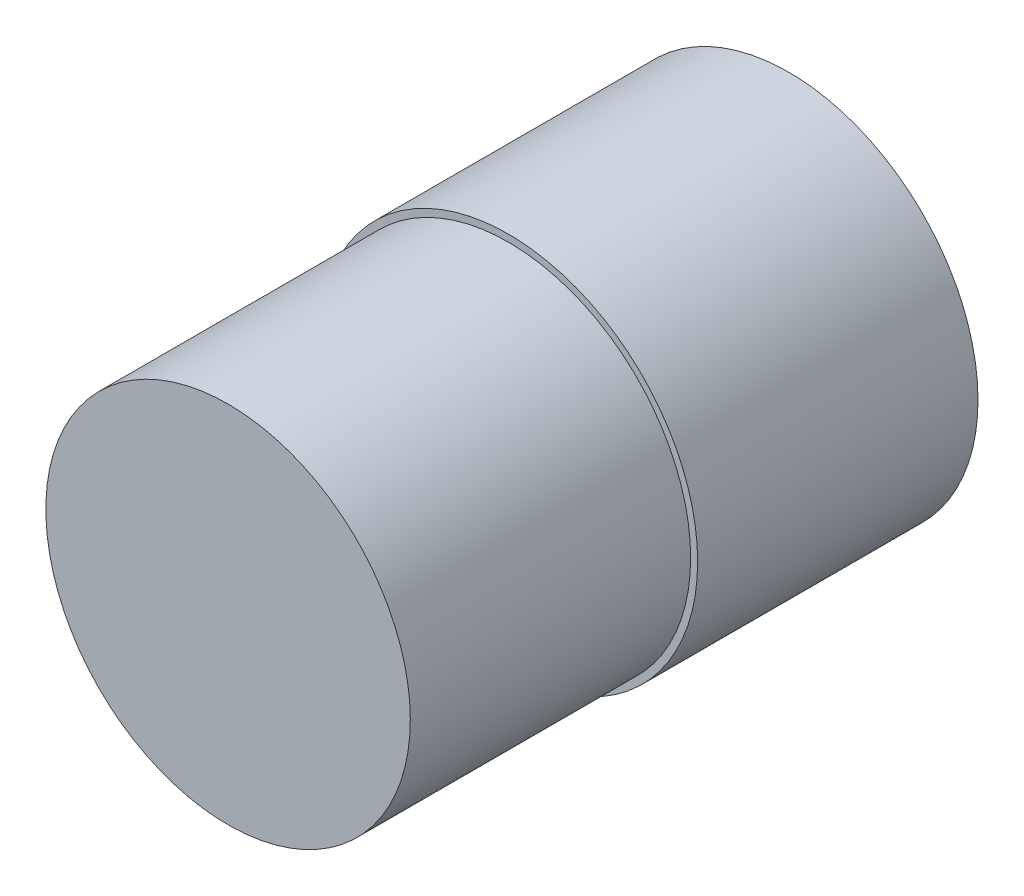
ISO-10303-21;
HEADER;
FILE_DESCRIPTION(('STEP AP214'),'2;1');
FILE_NAME('part.step','',(''),(''),'','','');
FILE_SCHEMA(('AUTOMOTIVE_DESIGN { 1 0 10303 214 1 1 1 1 }'));
ENDSEC;
DATA;
#1=APPLICATION_CONTEXT('core data for automotive mechanical design processes');
#2=APPLICATION_PROTOCOL_DEFINITION('international standard','automotive_design',2000,#1);
#3=PRODUCT_CONTEXT('',#1,'mechanical');
#4=PRODUCT('Part','Part','',(#3));
#5=PRODUCT_RELATED_PRODUCT_CATEGORY('part','',(#4));
#6=PRODUCT_DEFINITION_FORMATION('','',#4);
#7=PRODUCT_DEFINITION_CONTEXT('part definition',#1,'design');
#8=PRODUCT_DEFINITION('design','',#6,#7);
#9=PRODUCT_DEFINITION_SHAPE('','',#8);
#10=(LENGTH_UNIT() NAMED_UNIT(*) SI_UNIT(.MILLI.,.METRE.));
#11=(NAMED_UNIT(*) PLANE_ANGLE_UNIT() SI_UNIT($,.RADIAN.));
#12=(NAMED_UNIT(*) SI_UNIT($,.STERADIAN.) SOLID_ANGLE_UNIT());
#13=UNCERTAINTY_MEASURE_WITH_UNIT(LENGTH_MEASURE(1.E-05),#10,'distance_accuracy_value','');
#14=(GEOMETRIC_REPRESENTATION_CONTEXT(3) GLOBAL_UNCERTAINTY_ASSIGNED_CONTEXT((#13)) GLOBAL_UNIT_ASSIGNED_CONTEXT((#10,
#11,#12)) REPRESENTATION_CONTEXT('',''));
#15=CARTESIAN_POINT('',(0.,0.,0.));
#16=DIRECTION('',(0.,0.,1.));
#17=DIRECTION('',(1.,0.,0.));
#18=AXIS2_PLACEMENT_3D('',#15,#16,#17);
#19=CARTESIAN_POINT('',(0.,0.,10.));
#20=DIRECTION('',(0.,0.,1.));
#21=DIRECTION('',(1.,0.,0.));
#22=AXIS2_PLACEMENT_3D('',#19,#20,#21);
#23=PLANE('',#22);
#24=CARTESIAN_POINT('',(0.,0.,10.));
#25=DIRECTION('',(0.,0.,1.));
#26=DIRECTION('',(1.,0.,0.));
#27=AXIS2_PLACEMENT_3D('',#24,#25,#26);
#28=CIRCLE('',#27,6.75);
#29=CARTESIAN_POINT('',(6.75,0.,10.));
#30=VERTEX_POINT('',#29);
#31=EDGE_CURVE('E10',#30,#30,#28,.T.);
#32=ORIENTED_EDGE('',*,*,#31,.T.);
#33=EDGE_LOOP('',(#32));
#34=FACE_BOUND('',#33,.T.);
#35=CARTESIAN_POINT('',(0.,0.,10.));
#36=DIRECTION('',(0.,0.,1.));
#37=DIRECTION('',(1.,0.,0.));
#38=AXIS2_PLACEMENT_3D('',#35,#36,#37);
#39=CIRCLE('',#38,6.5);
#40=CARTESIAN_POINT('',(6.5,0.,10.));
#41=VERTEX_POINT('',#40);
#42=EDGE_CURVE('E55',#41,#41,#39,.T.);
#43=ORIENTED_EDGE('',*,*,#42,.F.);
#44=EDGE_LOOP('',(#43));
#45=FACE_BOUND('',#44,.T.);
#46=ADVANCED_FACE('F37',(#34,#45),#23,.T.);
#47=CARTESIAN_POINT('',(0.,0.,0.));
#48=DIRECTION('',(0.,0.,1.));
#49=DIRECTION('',(1.,0.,0.));
#50=AXIS2_PLACEMENT_3D('',#47,#48,#49);
#51=PLANE('',#50);
#52=CARTESIAN_POINT('',(0.,0.,0.));
#53=DIRECTION('',(0.,0.,1.));
#54=DIRECTION('',(1.,0.,0.));
#55=AXIS2_PLACEMENT_3D('',#52,#53,#54);
#56=CIRCLE('',#55,6.75);
#57=CARTESIAN_POINT('',(6.75,0.,0.));
#58=VERTEX_POINT('',#57);
#59=EDGE_CURVE('E41',#58,#58,#56,.T.);
#60=ORIENTED_EDGE('',*,*,#59,.F.);
#61=EDGE_LOOP('',(#60));
#62=FACE_BOUND('',#61,.T.);
#63=CARTESIAN_POINT('',(0.,0.,0.));
#64=DIRECTION('',(0.,0.,1.));
#65=DIRECTION('',(1.,0.,0.));
#66=AXIS2_PLACEMENT_3D('',#63,#64,#65);
#67=CIRCLE('',#66,2.725);
#68=CARTESIAN_POINT('',(2.725,0.,0.));
#69=VERTEX_POINT('',#68);
#70=EDGE_CURVE('E48',#69,#69,#67,.T.);
#71=ORIENTED_EDGE('',*,*,#70,.T.);
#72=EDGE_LOOP('',(#71));
#73=FACE_BOUND('',#72,.T.);
#74=ADVANCED_FACE('F66',(#62,#73),#51,.F.);
#75=CARTESIAN_POINT('',(0.,0.,10.));
#76=DIRECTION('',(0.,0.,-1.));
#77=DIRECTION('',(-1.,0.,0.));
#78=AXIS2_PLACEMENT_3D('',#75,#76,#77);
#79=CYLINDRICAL_SURFACE('',#78,6.75);
#80=ORIENTED_EDGE('',*,*,#31,.F.);
#81=EDGE_LOOP('',(#80));
#82=FACE_BOUND('',#81,.T.);
#83=ORIENTED_EDGE('',*,*,#59,.T.);
#84=EDGE_LOOP('',(#83));
#85=FACE_BOUND('',#84,.T.);
#86=ADVANCED_FACE('F39',(#82,#85),#79,.T.);
#87=CARTESIAN_POINT('',(0.,0.,10.));
#88=DIRECTION('',(0.,0.,-1.));
#89=DIRECTION('',(-1.,0.,0.));
#90=AXIS2_PLACEMENT_3D('',#87,#88,#89);
#91=CYLINDRICAL_SURFACE('',#90,2.725);
#92=CARTESIAN_POINT('',(0.,0.,10.));
#93=DIRECTION('',(0.,0.,1.));
#94=DIRECTION('',(1.,0.,0.));
#95=AXIS2_PLACEMENT_3D('',#92,#93,#94);
#96=CIRCLE('',#95,2.725);
#97=CARTESIAN_POINT('',(2.725,0.,10.));
#98=VERTEX_POINT('',#97);
#99=EDGE_CURVE('E52',#98,#98,#96,.T.);
#100=ORIENTED_EDGE('',*,*,#99,.T.);
#101=EDGE_LOOP('',(#100));
#102=FACE_BOUND('',#101,.T.);
#103=ORIENTED_EDGE('',*,*,#70,.F.);
#104=EDGE_LOOP('',(#103));
#105=FACE_BOUND('',#104,.T.);
#106=ADVANCED_FACE('F73',(#102,#105),#91,.F.);
#107=CARTESIAN_POINT('',(0.,0.,10.));
#108=DIRECTION('',(0.,0.,1.));
#109=DIRECTION('',(1.,0.,0.));
#110=AXIS2_PLACEMENT_3D('',#107,#108,#109);
#111=PLANE('',#110);
#112=ORIENTED_EDGE('',*,*,#99,.F.);
#113=EDGE_LOOP('',(#112));
#114=FACE_BOUND('',#113,.T.);
#115=ADVANCED_FACE('F76',(#114),#111,.F.);
#116=CARTESIAN_POINT('',(0.,0.,10.));
#117=DIRECTION('',(0.,0.,1.));
#118=DIRECTION('',(1.,0.,0.));
#119=AXIS2_PLACEMENT_3D('',#116,#117,#118);
#120=CYLINDRICAL_SURFACE('',#119,6.5);
#121=ORIENTED_EDGE('',*,*,#42,.T.);
#122=EDGE_LOOP('',(#121));
#123=FACE_BOUND('',#122,.T.);
#124=CARTESIAN_POINT('',(0.,0.,20.));
#125=DIRECTION('',(0.,0.,1.));
#126=DIRECTION('',(1.,0.,0.));
#127=AXIS2_PLACEMENT_3D('',#124,#125,#126);
#128=CIRCLE('',#127,6.5);
#129=CARTESIAN_POINT('',(6.5,0.,20.));
#130=VERTEX_POINT('',#129);
#131=EDGE_CURVE('E56',#130,#130,#128,.T.);
#132=ORIENTED_EDGE('',*,*,#131,.F.);
#133=EDGE_LOOP('',(#132));
#134=FACE_BOUND('',#133,.T.);
#135=ADVANCED_FACE('F62',(#123,#134),#120,.T.);
#136=CARTESIAN_POINT('',(0.,0.,20.));
#137=DIRECTION('',(0.,0.,1.));
#138=DIRECTION('',(1.,0.,0.));
#139=AXIS2_PLACEMENT_3D('',#136,#137,#138);
#140=PLANE('',#139);
#141=ORIENTED_EDGE('',*,*,#131,.T.);
#142=EDGE_LOOP('',(#141));
#143=FACE_BOUND('',#142,.T.);
#144=ADVANCED_FACE('F81',(#143),#140,.T.);
#145=CLOSED_SHELL('',(#46,#74,#86,#106,#115,#135,#144));
#146=MANIFOLD_SOLID_BREP('B2',#145);
#147=ADVANCED_BREP_SHAPE_REPRESENTATION('',(#18,#146),#14);
#148=SHAPE_DEFINITION_REPRESENTATION(#9,#147);
ENDSEC;
END-ISO-10303-21;
